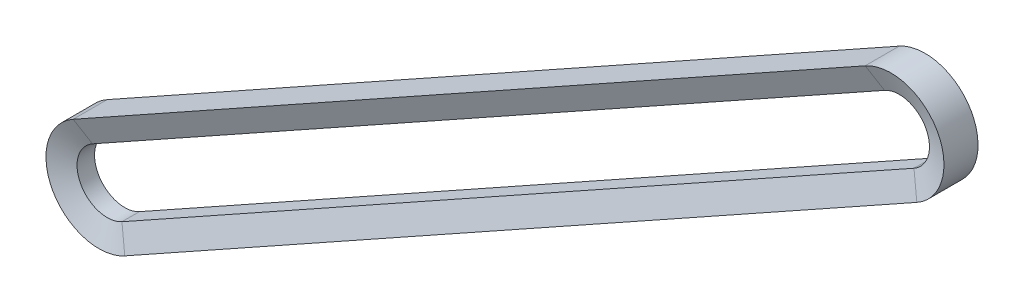
ISO-10303-21;
HEADER;
FILE_DESCRIPTION(('STEP AP214'),'2;1');
FILE_NAME('part.step','',(''),(''),'','','');
FILE_SCHEMA(('AUTOMOTIVE_DESIGN { 1 0 10303 214 1 1 1 1 }'));
ENDSEC;
DATA;
#1=APPLICATION_CONTEXT('core data for automotive mechanical design processes');
#2=APPLICATION_PROTOCOL_DEFINITION('international standard','automotive_design',2000,#1);
#3=PRODUCT_CONTEXT('',#1,'mechanical');
#4=PRODUCT('Part','Part','',(#3));
#5=PRODUCT_RELATED_PRODUCT_CATEGORY('part','',(#4));
#6=PRODUCT_DEFINITION_FORMATION('','',#4);
#7=PRODUCT_DEFINITION_CONTEXT('part definition',#1,'design');
#8=PRODUCT_DEFINITION('design','',#6,#7);
#9=PRODUCT_DEFINITION_SHAPE('','',#8);
#10=(LENGTH_UNIT() NAMED_UNIT(*) SI_UNIT(.MILLI.,.METRE.));
#11=(NAMED_UNIT(*) PLANE_ANGLE_UNIT() SI_UNIT($,.RADIAN.));
#12=(NAMED_UNIT(*) SI_UNIT($,.STERADIAN.) SOLID_ANGLE_UNIT());
#13=UNCERTAINTY_MEASURE_WITH_UNIT(LENGTH_MEASURE(1.E-05),#10,'distance_accuracy_value','');
#14=(GEOMETRIC_REPRESENTATION_CONTEXT(3) GLOBAL_UNCERTAINTY_ASSIGNED_CONTEXT((#13)) GLOBAL_UNIT_ASSIGNED_CONTEXT((#10,
#11,#12)) REPRESENTATION_CONTEXT('',''));
#15=CARTESIAN_POINT('',(0.,0.,0.));
#16=DIRECTION('',(0.,0.,1.));
#17=DIRECTION('',(1.,0.,0.));
#18=AXIS2_PLACEMENT_3D('',#15,#16,#17);
#19=CARTESIAN_POINT('',(-141.653131732104,-73.0403283421587,1.535));
#20=DIRECTION('',(0.487594759612301,-0.873070071872025,0.));
#21=DIRECTION('',(0.873070071872025,0.487594759612301,0.));
#22=AXIS2_PLACEMENT_3D('',#19,#20,#21);
#23=PLANE('',#22);
#24=DIRECTION('',(0.873070071872025,0.487594759612301,0.));
#25=VECTOR('',#24,1.);
#26=CARTESIAN_POINT('',(-141.653131732104,-73.0403283421587,1.535));
#27=LINE('',#26,#25);
#28=CARTESIAN_POINT('',(-141.653131732104,-73.0403283421587,1.535));
#29=VERTEX_POINT('',#28);
#30=CARTESIAN_POINT('',(-2.58425222591269,4.62727138093991,1.535));
#31=VERTEX_POINT('',#30);
#32=EDGE_CURVE('E11',#29,#31,#27,.T.);
#33=ORIENTED_EDGE('',*,*,#32,.F.);
#34=DIRECTION('',(0.,0.,-1.));
#35=VECTOR('',#34,1.);
#36=CARTESIAN_POINT('',(-141.653131732104,-73.0403283421587,1.535));
#37=LINE('',#36,#35);
#38=CARTESIAN_POINT('',(-141.653131732104,-73.0403283421587,-1.535));
#39=VERTEX_POINT('',#38);
#40=EDGE_CURVE('E42',#29,#39,#37,.T.);
#41=ORIENTED_EDGE('',*,*,#40,.T.);
#42=DIRECTION('',(0.873070071872025,0.487594759612301,0.));
#43=VECTOR('',#42,1.);
#44=CARTESIAN_POINT('',(-141.653131732104,-73.0403283421587,-1.535));
#45=LINE('',#44,#43);
#46=CARTESIAN_POINT('',(-2.58425222591269,4.62727138093991,-1.535));
#47=VERTEX_POINT('',#46);
#48=EDGE_CURVE('E127',#39,#47,#45,.T.);
#49=ORIENTED_EDGE('',*,*,#48,.T.);
#50=DIRECTION('',(0.,0.,-1.));
#51=VECTOR('',#50,1.);
#52=CARTESIAN_POINT('',(-2.58425222591269,4.62727138093991,1.535));
#53=LINE('',#52,#51);
#54=EDGE_CURVE('E130',#31,#47,#53,.T.);
#55=ORIENTED_EDGE('',*,*,#54,.F.);
#56=EDGE_LOOP('',(#33,#41,#49,#55));
#57=FACE_BOUND('',#56,.T.);
#58=ADVANCED_FACE('F39',(#57),#23,.T.);
#59=CARTESIAN_POINT('',(-141.653131732104,-73.0403283421587,1.535));
#60=DIRECTION('',(0.166767229567443,-0.298607551115019,0.93969262078591));
#61=DIRECTION('',(0.,-0.95303869478326,-0.302848553316373));
#62=AXIS2_PLACEMENT_3D('',#59,#60,#61);
#63=PLANE('',#62);
#64=DIRECTION('',(0.873070071872025,0.487594759612301,0.));
#65=VECTOR('',#64,1.);
#66=CARTESIAN_POINT('',(-143.603510770529,-69.5480480546569,2.9908809370648));
#67=LINE('',#66,#65);
#68=CARTESIAN_POINT('',(-143.603510770529,-69.5480480546569,2.9908809370648));
#69=VERTEX_POINT('',#68);
#70=CARTESIAN_POINT('',(-4.53463126433735,8.11955166844172,2.9908809370648));
#71=VERTEX_POINT('',#70);
#72=EDGE_CURVE('E47',#69,#71,#67,.T.);
#73=ORIENTED_EDGE('',*,*,#72,.F.);
#74=DIRECTION('',(-0.458189197535793,0.820417503970385,0.342020143325666));
#75=VECTOR('',#74,1.);
#76=CARTESIAN_POINT('',(-141.653131732104,-73.0403283421587,1.535));
#77=LINE('',#76,#75);
#78=EDGE_CURVE('E197',#69,#29,#77,.F.);
#79=ORIENTED_EDGE('',*,*,#78,.T.);
#80=ORIENTED_EDGE('',*,*,#32,.T.);
#81=DIRECTION('',(-0.458189197535793,0.820417503970385,0.342020143325666));
#82=VECTOR('',#81,1.);
#83=CARTESIAN_POINT('',(-2.58425222591269,4.62727138093991,1.535));
#84=LINE('',#83,#82);
#85=EDGE_CURVE('E155',#71,#31,#84,.F.);
#86=ORIENTED_EDGE('',*,*,#85,.F.);
#87=EDGE_LOOP('',(#73,#79,#80,#86));
#88=FACE_BOUND('',#87,.T.);
#89=ADVANCED_FACE('F221',(#88),#63,.T.);
#90=CARTESIAN_POINT('',(-143.603510770529,-69.5480480546569,-2.99088093706479));
#91=DIRECTION('',(-0.487594759612301,0.873070071872025,0.));
#92=DIRECTION('',(-0.873070071872025,-0.487594759612301,0.));
#93=AXIS2_PLACEMENT_3D('',#90,#91,#92);
#94=PLANE('',#93);
#95=DIRECTION('',(0.873070071872025,0.487594759612301,0.));
#96=VECTOR('',#95,1.);
#97=CARTESIAN_POINT('',(-143.603510770529,-69.5480480546569,-2.99088093706479));
#98=LINE('',#97,#96);
#99=CARTESIAN_POINT('',(-143.603510770529,-69.5480480546569,-2.99088093706479));
#100=VERTEX_POINT('',#99);
#101=CARTESIAN_POINT('',(-4.53463126433735,8.11955166844172,-2.99088093706479));
#102=VERTEX_POINT('',#101);
#103=EDGE_CURVE('E136',#100,#102,#98,.T.);
#104=ORIENTED_EDGE('',*,*,#103,.F.);
#105=DIRECTION('',(0.,0.,1.));
#106=VECTOR('',#105,1.);
#107=CARTESIAN_POINT('',(-143.603510770529,-69.5480480546569,-2.99088093706479));
#108=LINE('',#107,#106);
#109=EDGE_CURVE('E181',#100,#69,#108,.T.);
#110=ORIENTED_EDGE('',*,*,#109,.T.);
#111=ORIENTED_EDGE('',*,*,#72,.T.);
#112=DIRECTION('',(0.,0.,1.));
#113=VECTOR('',#112,1.);
#114=CARTESIAN_POINT('',(-4.53463126433735,8.11955166844172,-2.99088093706479));
#115=LINE('',#114,#113);
#116=EDGE_CURVE('E159',#102,#71,#115,.T.);
#117=ORIENTED_EDGE('',*,*,#116,.F.);
#118=EDGE_LOOP('',(#104,#110,#111,#117));
#119=FACE_BOUND('',#118,.T.);
#120=ADVANCED_FACE('F226',(#119),#94,.T.);
#121=CARTESIAN_POINT('',(-139.068879505673,-77.667599722048,0.));
#122=DIRECTION('',(0.,0.,-1.));
#123=DIRECTION('',(-1.,0.,0.));
#124=AXIS2_PLACEMENT_3D('',#121,#122,#123);
#125=CYLINDRICAL_SURFACE('',#124,5.29999999933549);
#126=ORIENTED_EDGE('',*,*,#40,.F.);
#127=CARTESIAN_POINT('',(-139.068879505673,-77.667599722048,1.535));
#128=DIRECTION('',(0.,0.,-1.));
#129=DIRECTION('',(0.487594759765127,-0.873070071786674,0.));
#130=AXIS2_PLACEMENT_3D('',#127,#128,#129);
#131=CIRCLE('',#130,5.29999999933549);
#132=CARTESIAN_POINT('',(-136.484627278594,-82.2948711030975,1.535));
#133=VERTEX_POINT('',#132);
#134=EDGE_CURVE('E83',#133,#29,#131,.T.);
#135=ORIENTED_EDGE('',*,*,#134,.F.);
#136=DIRECTION('',(0.,0.,-1.));
#137=VECTOR('',#136,1.);
#138=CARTESIAN_POINT('',(-136.484627279242,-82.2948711019371,1.535));
#139=LINE('',#138,#137);
#140=CARTESIAN_POINT('',(-136.484627278594,-82.2948711030975,-1.535));
#141=VERTEX_POINT('',#140);
#142=EDGE_CURVE('E184',#133,#141,#139,.T.);
#143=ORIENTED_EDGE('',*,*,#142,.T.);
#144=CARTESIAN_POINT('',(-139.068879505673,-77.667599722048,-1.535));
#145=DIRECTION('',(0.,0.,-1.));
#146=DIRECTION('',(0.487594759765127,-0.873070071786674,0.));
#147=AXIS2_PLACEMENT_3D('',#144,#145,#146);
#148=CIRCLE('',#147,5.29999999933549);
#149=EDGE_CURVE('E179',#141,#39,#148,.T.);
#150=ORIENTED_EDGE('',*,*,#149,.T.);
#151=EDGE_LOOP('',(#126,#135,#143,#150));
#152=FACE_BOUND('',#151,.T.);
#153=ADVANCED_FACE('F210',(#152),#125,.F.);
#154=CARTESIAN_POINT('',(-139.068879505673,-77.667599722048,2.9908809370648));
#155=DIRECTION('',(0.,0.,1.));
#156=DIRECTION('',(1.,0.,0.));
#157=AXIS2_PLACEMENT_3D('',#154,#155,#156);
#158=CONICAL_SURFACE('',#157,9.29999999933548,1.22173047639603);
#159=ORIENTED_EDGE('',*,*,#134,.T.);
#160=ORIENTED_EDGE('',*,*,#78,.F.);
#161=CARTESIAN_POINT('',(-139.068879505673,-77.667599722048,2.9908809370648));
#162=DIRECTION('',(0.,0.,-1.));
#163=DIRECTION('',(0.487594759696756,-0.873070071824858,0.));
#164=AXIS2_PLACEMENT_3D('',#161,#162,#163);
#165=CIRCLE('',#164,9.29999999933548);
#166=CARTESIAN_POINT('',(-134.534248240169,-85.7871513905993,2.9908809370648));
#167=VERTEX_POINT('',#166);
#168=EDGE_CURVE('E92',#167,#69,#165,.T.);
#169=ORIENTED_EDGE('',*,*,#168,.F.);
#170=DIRECTION('',(0.458189197535793,-0.820417503970385,0.342020143325666));
#171=VECTOR('',#170,1.);
#172=CARTESIAN_POINT('',(-136.484627279242,-82.2948711019371,1.535));
#173=LINE('',#172,#171);
#174=EDGE_CURVE('E193',#167,#133,#173,.F.);
#175=ORIENTED_EDGE('',*,*,#174,.T.);
#176=EDGE_LOOP('',(#159,#160,#169,#175));
#177=FACE_BOUND('',#176,.T.);
#178=ADVANCED_FACE('F220',(#177),#158,.F.);
#179=CARTESIAN_POINT('',(-139.068879505673,-77.667599722048,0.));
#180=DIRECTION('',(0.,0.,-1.));
#181=DIRECTION('',(-1.,0.,0.));
#182=AXIS2_PLACEMENT_3D('',#179,#180,#181);
#183=CYLINDRICAL_SURFACE('',#182,9.29999999933548);
#184=ORIENTED_EDGE('',*,*,#168,.T.);
#185=ORIENTED_EDGE('',*,*,#109,.F.);
#186=CARTESIAN_POINT('',(-139.068879505673,-77.667599722048,-2.99088093706479));
#187=DIRECTION('',(0.,0.,-1.));
#188=DIRECTION('',(0.487594759696756,-0.873070071824858,0.));
#189=AXIS2_PLACEMENT_3D('',#186,#187,#188);
#190=CIRCLE('',#189,9.29999999933548);
#191=CARTESIAN_POINT('',(-134.534248240169,-85.7871513905993,-2.99088093706479));
#192=VERTEX_POINT('',#191);
#193=EDGE_CURVE('E100',#192,#100,#190,.T.);
#194=ORIENTED_EDGE('',*,*,#193,.F.);
#195=DIRECTION('',(0.,0.,1.));
#196=VECTOR('',#195,1.);
#197=CARTESIAN_POINT('',(-134.534248240817,-85.787151389439,-2.99088093706479));
#198=LINE('',#197,#196);
#199=EDGE_CURVE('E173',#192,#167,#198,.T.);
#200=ORIENTED_EDGE('',*,*,#199,.T.);
#201=EDGE_LOOP('',(#184,#185,#194,#200));
#202=FACE_BOUND('',#201,.T.);
#203=ADVANCED_FACE('F227',(#202),#183,.T.);
#204=CARTESIAN_POINT('',(-139.068879505673,-77.667599722048,-1.535));
#205=DIRECTION('',(0.,0.,-1.));
#206=DIRECTION('',(-1.,0.,0.));
#207=AXIS2_PLACEMENT_3D('',#204,#205,#206);
#208=CONICAL_SURFACE('',#207,5.29999999933549,1.22173047639603);
#209=ORIENTED_EDGE('',*,*,#193,.T.);
#210=DIRECTION('',(-0.458189197535793,0.820417503970385,-0.342020143325666));
#211=VECTOR('',#210,1.);
#212=CARTESIAN_POINT('',(-141.653131732104,-73.0403283421587,-1.535));
#213=LINE('',#212,#211);
#214=EDGE_CURVE('E177',#39,#100,#213,.T.);
#215=ORIENTED_EDGE('',*,*,#214,.F.);
#216=ORIENTED_EDGE('',*,*,#149,.F.);
#217=DIRECTION('',(0.458189197535793,-0.820417503970385,-0.342020143325666));
#218=VECTOR('',#217,1.);
#219=CARTESIAN_POINT('',(-136.484627279242,-82.2948711019371,-1.535));
#220=LINE('',#219,#218);
#221=EDGE_CURVE('E168',#141,#192,#220,.T.);
#222=ORIENTED_EDGE('',*,*,#221,.T.);
#223=EDGE_LOOP('',(#209,#215,#216,#222));
#224=FACE_BOUND('',#223,.T.);
#225=ADVANCED_FACE('F228',(#224),#208,.F.);
#226=CARTESIAN_POINT('',(2.58425222591269,-4.62727138093991,1.535));
#227=DIRECTION('',(-0.487594759612301,0.873070071872025,0.));
#228=DIRECTION('',(-0.873070071872025,-0.487594759612301,0.));
#229=AXIS2_PLACEMENT_3D('',#226,#227,#228);
#230=PLANE('',#229);
#231=ORIENTED_EDGE('',*,*,#142,.F.);
#232=DIRECTION('',(-0.873070071872025,-0.487594759612301,0.));
#233=VECTOR('',#232,1.);
#234=CARTESIAN_POINT('',(2.58425222591269,-4.62727138093991,1.535));
#235=LINE('',#234,#233);
#236=CARTESIAN_POINT('',(2.58425222526464,-4.62727137977953,1.535));
#237=VERTEX_POINT('',#236);
#238=EDGE_CURVE('E203',#237,#133,#235,.T.);
#239=ORIENTED_EDGE('',*,*,#238,.F.);
#240=DIRECTION('',(0.,0.,-1.));
#241=VECTOR('',#240,1.);
#242=CARTESIAN_POINT('',(2.58425222591269,-4.62727138093991,1.535));
#243=LINE('',#242,#241);
#244=CARTESIAN_POINT('',(2.58425222526464,-4.62727137977953,-1.535));
#245=VERTEX_POINT('',#244);
#246=EDGE_CURVE('E176',#237,#245,#243,.T.);
#247=ORIENTED_EDGE('',*,*,#246,.T.);
#248=DIRECTION('',(-0.873070071872025,-0.487594759612301,0.));
#249=VECTOR('',#248,1.);
#250=CARTESIAN_POINT('',(2.58425222591269,-4.62727138093991,-1.535));
#251=LINE('',#250,#249);
#252=EDGE_CURVE('E171',#245,#141,#251,.T.);
#253=ORIENTED_EDGE('',*,*,#252,.T.);
#254=EDGE_LOOP('',(#231,#239,#247,#253));
#255=FACE_BOUND('',#254,.T.);
#256=ADVANCED_FACE('F215',(#255),#230,.T.);
#257=CARTESIAN_POINT('',(2.58425222591269,-4.62727138093991,1.535));
#258=DIRECTION('',(-0.166767229567443,0.298607551115019,0.93969262078591));
#259=DIRECTION('',(0.,-0.95303869478326,0.302848553316373));
#260=AXIS2_PLACEMENT_3D('',#257,#258,#259);
#261=PLANE('',#260);
#262=ORIENTED_EDGE('',*,*,#238,.T.);
#263=ORIENTED_EDGE('',*,*,#174,.F.);
#264=DIRECTION('',(-0.873070071872025,-0.487594759612301,0.));
#265=VECTOR('',#264,1.);
#266=CARTESIAN_POINT('',(4.53463126433735,-8.11955166844172,2.9908809370648));
#267=LINE('',#266,#265);
#268=CARTESIAN_POINT('',(4.53463126368931,-8.11955166728133,2.9908809370648));
#269=VERTEX_POINT('',#268);
#270=EDGE_CURVE('E112',#269,#167,#267,.T.);
#271=ORIENTED_EDGE('',*,*,#270,.F.);
#272=DIRECTION('',(0.458189197535794,-0.820417503970385,0.342020143325666));
#273=VECTOR('',#272,1.);
#274=CARTESIAN_POINT('',(2.58425222591269,-4.62727138093991,1.535));
#275=LINE('',#274,#273);
#276=EDGE_CURVE('E190',#269,#237,#275,.F.);
#277=ORIENTED_EDGE('',*,*,#276,.T.);
#278=EDGE_LOOP('',(#262,#263,#271,#277));
#279=FACE_BOUND('',#278,.T.);
#280=ADVANCED_FACE('F219',(#279),#261,.T.);
#281=CARTESIAN_POINT('',(4.53463126433735,-8.11955166844172,-2.99088093706479));
#282=DIRECTION('',(0.487594759612301,-0.873070071872025,0.));
#283=DIRECTION('',(0.873070071872025,0.487594759612301,0.));
#284=AXIS2_PLACEMENT_3D('',#281,#282,#283);
#285=PLANE('',#284);
#286=ORIENTED_EDGE('',*,*,#270,.T.);
#287=ORIENTED_EDGE('',*,*,#199,.F.);
#288=DIRECTION('',(-0.873070071872025,-0.487594759612301,0.));
#289=VECTOR('',#288,1.);
#290=CARTESIAN_POINT('',(4.53463126433735,-8.11955166844172,-2.99088093706479));
#291=LINE('',#290,#289);
#292=CARTESIAN_POINT('',(4.53463126368931,-8.11955166728133,-2.99088093706479));
#293=VERTEX_POINT('',#292);
#294=EDGE_CURVE('E118',#293,#192,#291,.T.);
#295=ORIENTED_EDGE('',*,*,#294,.F.);
#296=DIRECTION('',(0.,0.,1.));
#297=VECTOR('',#296,1.);
#298=CARTESIAN_POINT('',(4.53463126433736,-8.11955166844172,-2.99088093706479));
#299=LINE('',#298,#297);
#300=EDGE_CURVE('E166',#293,#269,#299,.T.);
#301=ORIENTED_EDGE('',*,*,#300,.T.);
#302=EDGE_LOOP('',(#286,#287,#295,#301));
#303=FACE_BOUND('',#302,.T.);
#304=ADVANCED_FACE('F284',(#303),#285,.T.);
#305=CARTESIAN_POINT('',(2.58425222591269,-4.62727138093991,-1.535));
#306=DIRECTION('',(-0.166767229567443,0.298607551115019,-0.93969262078591));
#307=DIRECTION('',(0.,0.95303869478326,0.302848553316373));
#308=AXIS2_PLACEMENT_3D('',#305,#306,#307);
#309=PLANE('',#308);
#310=ORIENTED_EDGE('',*,*,#294,.T.);
#311=ORIENTED_EDGE('',*,*,#221,.F.);
#312=ORIENTED_EDGE('',*,*,#252,.F.);
#313=DIRECTION('',(0.458189197535794,-0.820417503970385,-0.342020143325666));
#314=VECTOR('',#313,1.);
#315=CARTESIAN_POINT('',(2.58425222591269,-4.62727138093991,-1.535));
#316=LINE('',#315,#314);
#317=EDGE_CURVE('E147',#245,#293,#316,.T.);
#318=ORIENTED_EDGE('',*,*,#317,.T.);
#319=EDGE_LOOP('',(#310,#311,#312,#318));
#320=FACE_BOUND('',#319,.T.);
#321=ADVANCED_FACE('F213',(#320),#309,.T.);
#322=CARTESIAN_POINT('',(5.18474152499948E-10,1.05071507050525E-09,0.));
#323=DIRECTION('',(0.,0.,-1.));
#324=DIRECTION('',(-1.,0.,0.));
#325=AXIS2_PLACEMENT_3D('',#322,#323,#324);
#326=CYLINDRICAL_SURFACE('',#325,5.29999999933548);
#327=ORIENTED_EDGE('',*,*,#246,.F.);
#328=CARTESIAN_POINT('',(5.18474152499948E-10,1.05071507050525E-09,1.535));
#329=DIRECTION('',(0.,0.,-1.));
#330=DIRECTION('',(-0.487594759765128,0.873070071786673,0.));
#331=AXIS2_PLACEMENT_3D('',#328,#329,#330);
#332=CIRCLE('',#331,5.29999999933548);
#333=EDGE_CURVE('E154',#31,#237,#332,.T.);
#334=ORIENTED_EDGE('',*,*,#333,.F.);
#335=ORIENTED_EDGE('',*,*,#54,.T.);
#336=CARTESIAN_POINT('',(5.18474152499948E-10,1.05071507050525E-09,-1.535));
#337=DIRECTION('',(0.,0.,-1.));
#338=DIRECTION('',(-0.487594759765128,0.873070071786673,0.));
#339=AXIS2_PLACEMENT_3D('',#336,#337,#338);
#340=CIRCLE('',#339,5.29999999933548);
#341=EDGE_CURVE('E142',#47,#245,#340,.T.);
#342=ORIENTED_EDGE('',*,*,#341,.T.);
#343=EDGE_LOOP('',(#327,#334,#335,#342));
#344=FACE_BOUND('',#343,.T.);
#345=ADVANCED_FACE('F152',(#344),#326,.F.);
#346=CARTESIAN_POINT('',(5.18474152499948E-10,1.05071507050525E-09,2.9908809370648));
#347=DIRECTION('',(0.,0.,1.));
#348=DIRECTION('',(1.,0.,0.));
#349=AXIS2_PLACEMENT_3D('',#346,#347,#348);
#350=CONICAL_SURFACE('',#349,9.29999999933549,1.22173047639603);
#351=ORIENTED_EDGE('',*,*,#333,.T.);
#352=ORIENTED_EDGE('',*,*,#276,.F.);
#353=CARTESIAN_POINT('',(5.18474152499948E-10,1.05071507050525E-09,2.9908809370648));
#354=DIRECTION('',(0.,0.,-1.));
#355=DIRECTION('',(-0.487594759696757,0.873070071824857,0.));
#356=AXIS2_PLACEMENT_3D('',#353,#354,#355);
#357=CIRCLE('',#356,9.29999999933548);
#358=EDGE_CURVE('E187',#71,#269,#357,.T.);
#359=ORIENTED_EDGE('',*,*,#358,.F.);
#360=ORIENTED_EDGE('',*,*,#85,.T.);
#361=EDGE_LOOP('',(#351,#352,#359,#360));
#362=FACE_BOUND('',#361,.T.);
#363=ADVANCED_FACE('F217',(#362),#350,.F.);
#364=CARTESIAN_POINT('',(5.18474152499948E-10,1.05071507050525E-09,0.));
#365=DIRECTION('',(0.,0.,-1.));
#366=DIRECTION('',(-1.,0.,0.));
#367=AXIS2_PLACEMENT_3D('',#364,#365,#366);
#368=CYLINDRICAL_SURFACE('',#367,9.29999999933548);
#369=ORIENTED_EDGE('',*,*,#358,.T.);
#370=ORIENTED_EDGE('',*,*,#300,.F.);
#371=CARTESIAN_POINT('',(5.18474152499948E-10,1.05071507050525E-09,-2.99088093706479));
#372=DIRECTION('',(0.,0.,-1.));
#373=DIRECTION('',(-0.487594759696757,0.873070071824857,0.));
#374=AXIS2_PLACEMENT_3D('',#371,#372,#373);
#375=CIRCLE('',#374,9.29999999933548);
#376=EDGE_CURVE('E165',#102,#293,#375,.T.);
#377=ORIENTED_EDGE('',*,*,#376,.F.);
#378=ORIENTED_EDGE('',*,*,#116,.T.);
#379=EDGE_LOOP('',(#369,#370,#377,#378));
#380=FACE_BOUND('',#379,.T.);
#381=ADVANCED_FACE('F224',(#380),#368,.T.);
#382=CARTESIAN_POINT('',(5.18474152499948E-10,1.05071507050525E-09,-1.535));
#383=DIRECTION('',(0.,0.,-1.));
#384=DIRECTION('',(-1.,0.,0.));
#385=AXIS2_PLACEMENT_3D('',#382,#383,#384);
#386=CONICAL_SURFACE('',#385,5.29999999933548,1.22173047639603);
#387=ORIENTED_EDGE('',*,*,#376,.T.);
#388=ORIENTED_EDGE('',*,*,#317,.F.);
#389=ORIENTED_EDGE('',*,*,#341,.F.);
#390=DIRECTION('',(-0.458189197535793,0.820417503970385,-0.342020143325666));
#391=VECTOR('',#390,1.);
#392=CARTESIAN_POINT('',(-2.58425222591269,4.62727138093991,-1.535));
#393=LINE('',#392,#391);
#394=EDGE_CURVE('E145',#47,#102,#393,.T.);
#395=ORIENTED_EDGE('',*,*,#394,.T.);
#396=EDGE_LOOP('',(#387,#388,#389,#395));
#397=FACE_BOUND('',#396,.T.);
#398=ADVANCED_FACE('F144',(#397),#386,.F.);
#399=CARTESIAN_POINT('',(-141.653131732104,-73.0403283421587,-1.535));
#400=DIRECTION('',(0.166767229567443,-0.298607551115019,-0.93969262078591));
#401=DIRECTION('',(0.,0.95303869478326,-0.302848553316373));
#402=AXIS2_PLACEMENT_3D('',#399,#400,#401);
#403=PLANE('',#402);
#404=ORIENTED_EDGE('',*,*,#214,.T.);
#405=ORIENTED_EDGE('',*,*,#103,.T.);
#406=ORIENTED_EDGE('',*,*,#394,.F.);
#407=ORIENTED_EDGE('',*,*,#48,.F.);
#408=EDGE_LOOP('',(#404,#405,#406,#407));
#409=FACE_BOUND('',#408,.T.);
#410=ADVANCED_FACE('F157',(#409),#403,.T.);
#411=CLOSED_SHELL('',(#58,#89,#120,#153,#178,#203,#225,#256,#280,#304,#321,#345,#363,#381,#398,#410));
#412=MANIFOLD_SOLID_BREP('B2',#411);
#413=ADVANCED_BREP_SHAPE_REPRESENTATION('',(#18,#412),#14);
#414=SHAPE_DEFINITION_REPRESENTATION(#9,#413);
ENDSEC;
END-ISO-10303-21;
